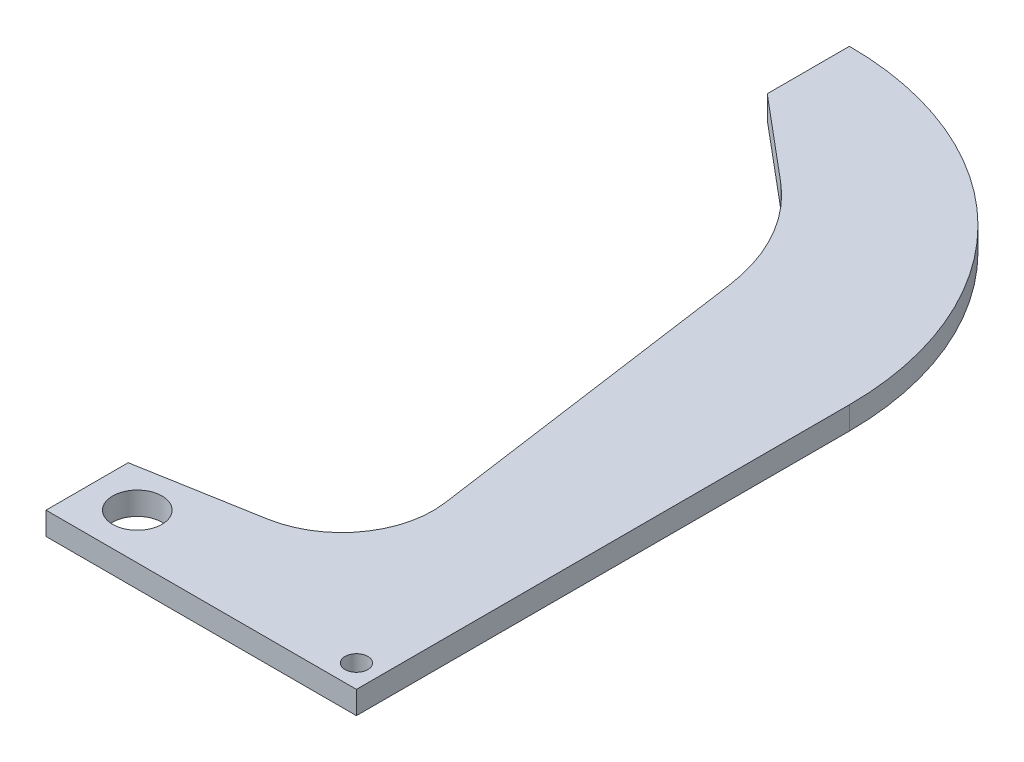
ISO-10303-21;
HEADER;
FILE_DESCRIPTION(('STEP AP214'),'2;1');
FILE_NAME('part.step','',(''),(''),'','','');
FILE_SCHEMA(('AUTOMOTIVE_DESIGN { 1 0 10303 214 1 1 1 1 }'));
ENDSEC;
DATA;
#1=APPLICATION_CONTEXT('core data for automotive mechanical design processes');
#2=APPLICATION_PROTOCOL_DEFINITION('international standard','automotive_design',2000,#1);
#3=PRODUCT_CONTEXT('',#1,'mechanical');
#4=PRODUCT('Part','Part','',(#3));
#5=PRODUCT_RELATED_PRODUCT_CATEGORY('part','',(#4));
#6=PRODUCT_DEFINITION_FORMATION('','',#4);
#7=PRODUCT_DEFINITION_CONTEXT('part definition',#1,'design');
#8=PRODUCT_DEFINITION('design','',#6,#7);
#9=PRODUCT_DEFINITION_SHAPE('','',#8);
#10=(LENGTH_UNIT() NAMED_UNIT(*) SI_UNIT(.MILLI.,.METRE.));
#11=(NAMED_UNIT(*) PLANE_ANGLE_UNIT() SI_UNIT($,.RADIAN.));
#12=(NAMED_UNIT(*) SI_UNIT($,.STERADIAN.) SOLID_ANGLE_UNIT());
#13=UNCERTAINTY_MEASURE_WITH_UNIT(LENGTH_MEASURE(1.E-05),#10,'distance_accuracy_value','');
#14=(GEOMETRIC_REPRESENTATION_CONTEXT(3) GLOBAL_UNCERTAINTY_ASSIGNED_CONTEXT((#13)) GLOBAL_UNIT_ASSIGNED_CONTEXT((#10,
#11,#12)) REPRESENTATION_CONTEXT('',''));
#15=CARTESIAN_POINT('',(0.,0.,0.));
#16=DIRECTION('',(0.,0.,1.));
#17=DIRECTION('',(1.,0.,0.));
#18=AXIS2_PLACEMENT_3D('',#15,#16,#17);
#19=CARTESIAN_POINT('',(0.,3.175,0.));
#20=DIRECTION('',(1.,0.,0.));
#21=DIRECTION('',(0.,0.,-1.));
#22=AXIS2_PLACEMENT_3D('',#19,#20,#21);
#23=PLANE('',#22);
#24=DIRECTION('',(0.,0.,1.));
#25=VECTOR('',#24,1.);
#26=CARTESIAN_POINT('',(0.,0.,0.));
#27=LINE('',#26,#25);
#28=CARTESIAN_POINT('',(0.,0.,-111.76));
#29=VERTEX_POINT('',#28);
#30=CARTESIAN_POINT('',(0.,0.,-100.33));
#31=VERTEX_POINT('',#30);
#32=EDGE_CURVE('E149',#29,#31,#27,.T.);
#33=ORIENTED_EDGE('',*,*,#32,.T.);
#34=DIRECTION('',(0.,1.,0.));
#35=VECTOR('',#34,1.);
#36=CARTESIAN_POINT('',(0.,0.,-100.33));
#37=LINE('',#36,#35);
#38=CARTESIAN_POINT('',(0.,3.175,-100.33));
#39=VERTEX_POINT('',#38);
#40=EDGE_CURVE('E131',#31,#39,#37,.T.);
#41=ORIENTED_EDGE('',*,*,#40,.T.);
#42=DIRECTION('',(0.,0.,1.));
#43=VECTOR('',#42,1.);
#44=CARTESIAN_POINT('',(0.,3.175,0.));
#45=LINE('',#44,#43);
#46=CARTESIAN_POINT('',(0.,3.175,-111.76));
#47=VERTEX_POINT('',#46);
#48=EDGE_CURVE('E217',#47,#39,#45,.T.);
#49=ORIENTED_EDGE('',*,*,#48,.F.);
#50=DIRECTION('',(0.,-1.,0.));
#51=VECTOR('',#50,1.);
#52=CARTESIAN_POINT('',(0.,3.175,-111.76));
#53=LINE('',#52,#51);
#54=EDGE_CURVE('E155',#47,#29,#53,.T.);
#55=ORIENTED_EDGE('',*,*,#54,.T.);
#56=EDGE_LOOP('',(#33,#41,#49,#55));
#57=FACE_BOUND('',#56,.T.);
#58=ADVANCED_FACE('F43',(#57),#23,.F.);
#59=CARTESIAN_POINT('',(0.,3.175,-68.58));
#60=DIRECTION('',(0.,1.,0.));
#61=DIRECTION('',(0.,0.,1.));
#62=AXIS2_PLACEMENT_3D('',#59,#60,#61);
#63=PLANE('',#62);
#64=DIRECTION('',(-0.76604444311898,0.,-0.642787609686536));
#65=VECTOR('',#64,1.);
#66=CARTESIAN_POINT('',(11.5786264068714,3.175,-90.6143788524547));
#67=LINE('',#66,#65);
#68=CARTESIAN_POINT('',(11.5786264068714,3.175,-90.6143788524547));
#69=VERTEX_POINT('',#68);
#70=EDGE_CURVE('E137',#69,#39,#67,.T.);
#71=ORIENTED_EDGE('',*,*,#70,.F.);
#72=CARTESIAN_POINT('',(-4.74817887916662,3.175,-71.1568499972326));
#73=DIRECTION('',(0.,1.,0.));
#74=DIRECTION('',(0.,0.,1.));
#75=AXIS2_PLACEMENT_3D('',#72,#73,#74);
#76=CIRCLE('',#75,25.4);
#77=CARTESIAN_POINT('',(20.4053667628325,3.175,-74.6866009283702));
#78=VERTEX_POINT('',#77);
#79=EDGE_CURVE('E153',#78,#69,#76,.T.);
#80=ORIENTED_EDGE('',*,*,#79,.F.);
#81=DIRECTION('',(-0.13896657209203,0.,-0.990297072519651));
#82=VECTOR('',#81,1.);
#83=CARTESIAN_POINT('',(26.8710352001998,3.175,-28.6112575632968));
#84=LINE('',#83,#82);
#85=CARTESIAN_POINT('',(26.8710352001998,3.175,-28.6112575632968));
#86=VERTEX_POINT('',#85);
#87=EDGE_CURVE('E241',#86,#78,#84,.T.);
#88=ORIENTED_EDGE('',*,*,#87,.F.);
#89=CARTESIAN_POINT('',(14.2942623792002,3.175,-26.846382097728));
#90=DIRECTION('',(0.,1.,0.));
#91=DIRECTION('',(0.,0.,-1.));
#92=AXIS2_PLACEMENT_3D('',#89,#90,#91);
#93=CIRCLE('',#92,12.7);
#94=CARTESIAN_POINT('',(16.4995942355703,3.175,-14.339323634473));
#95=VERTEX_POINT('',#94);
#96=EDGE_CURVE('E233',#95,#86,#93,.T.);
#97=ORIENTED_EDGE('',*,*,#96,.F.);
#98=DIRECTION('',(0.984807753012207,0.,-0.173648177666935));
#99=VECTOR('',#98,1.);
#100=CARTESIAN_POINT('',(16.4995942355703,3.175,-14.339323634473));
#101=LINE('',#100,#99);
#102=CARTESIAN_POINT('',(0.,3.175,-11.43));
#103=VERTEX_POINT('',#102);
#104=EDGE_CURVE('E230',#103,#95,#101,.T.);
#105=ORIENTED_EDGE('',*,*,#104,.F.);
#106=CARTESIAN_POINT('',(0.,3.175,0.));
#107=VERTEX_POINT('',#106);
#108=EDGE_CURVE('E96',#103,#107,#45,.T.);
#109=ORIENTED_EDGE('',*,*,#108,.T.);
#110=DIRECTION('',(1.,0.,0.));
#111=VECTOR('',#110,1.);
#112=CARTESIAN_POINT('',(0.,3.175,0.));
#113=LINE('',#112,#111);
#114=CARTESIAN_POINT('',(43.18,3.175,0.));
#115=VERTEX_POINT('',#114);
#116=EDGE_CURVE('E190',#107,#115,#113,.T.);
#117=ORIENTED_EDGE('',*,*,#116,.T.);
#118=DIRECTION('',(0.,0.,-1.));
#119=VECTOR('',#118,1.);
#120=CARTESIAN_POINT('',(43.18,3.175,0.));
#121=LINE('',#120,#119);
#122=CARTESIAN_POINT('',(43.18,3.175,-68.58));
#123=VERTEX_POINT('',#122);
#124=EDGE_CURVE('E184',#115,#123,#121,.T.);
#125=ORIENTED_EDGE('',*,*,#124,.T.);
#126=CARTESIAN_POINT('',(0.,3.175,-68.58));
#127=DIRECTION('',(0.,1.,0.));
#128=DIRECTION('',(0.,0.,1.));
#129=AXIS2_PLACEMENT_3D('',#126,#127,#128);
#130=CIRCLE('',#129,43.18);
#131=EDGE_CURVE('E68',#123,#47,#130,.T.);
#132=ORIENTED_EDGE('',*,*,#131,.T.);
#133=ORIENTED_EDGE('',*,*,#48,.T.);
#134=EDGE_LOOP('',(#71,#80,#88,#97,#105,#109,#117,#125,#132,#133));
#135=FACE_BOUND('',#134,.T.);
#136=CARTESIAN_POINT('',(6.35,3.175,-6.35));
#137=DIRECTION('',(0.,1.,0.));
#138=DIRECTION('',(0.,0.,1.));
#139=AXIS2_PLACEMENT_3D('',#136,#137,#138);
#140=CIRCLE('',#139,3.429);
#141=CARTESIAN_POINT('',(6.35,3.175,-2.921));
#142=VERTEX_POINT('',#141);
#143=EDGE_CURVE('E164',#142,#142,#140,.T.);
#144=ORIENTED_EDGE('',*,*,#143,.F.);
#145=EDGE_LOOP('',(#144));
#146=FACE_BOUND('',#145,.T.);
#147=CARTESIAN_POINT('',(40.005,3.175,-3.175));
#148=DIRECTION('',(0.,1.,0.));
#149=DIRECTION('',(0.,0.,1.));
#150=AXIS2_PLACEMENT_3D('',#147,#148,#149);
#151=CIRCLE('',#150,1.5875);
#152=CARTESIAN_POINT('',(40.005,3.175,-1.5875));
#153=VERTEX_POINT('',#152);
#154=EDGE_CURVE('E201',#153,#153,#151,.T.);
#155=ORIENTED_EDGE('',*,*,#154,.F.);
#156=EDGE_LOOP('',(#155));
#157=FACE_BOUND('',#156,.T.);
#158=ADVANCED_FACE('F223',(#135,#146,#157),#63,.T.);
#159=CARTESIAN_POINT('',(0.,0.,-68.58));
#160=DIRECTION('',(0.,1.,0.));
#161=DIRECTION('',(0.,0.,1.));
#162=AXIS2_PLACEMENT_3D('',#159,#160,#161);
#163=PLANE('',#162);
#164=CARTESIAN_POINT('',(-4.74817887916662,0.,-71.1568499972326));
#165=DIRECTION('',(0.,1.,0.));
#166=DIRECTION('',(0.,0.,1.));
#167=AXIS2_PLACEMENT_3D('',#164,#165,#166);
#168=CIRCLE('',#167,25.4);
#169=CARTESIAN_POINT('',(20.4053667628325,0.,-74.6866009283702));
#170=VERTEX_POINT('',#169);
#171=CARTESIAN_POINT('',(11.5786264068714,0.,-90.6143788524547));
#172=VERTEX_POINT('',#171);
#173=EDGE_CURVE('E143',#170,#172,#168,.T.);
#174=ORIENTED_EDGE('',*,*,#173,.T.);
#175=DIRECTION('',(-0.76604444311898,0.,-0.642787609686536));
#176=VECTOR('',#175,1.);
#177=CARTESIAN_POINT('',(11.5786264068714,0.,-90.6143788524547));
#178=LINE('',#177,#176);
#179=EDGE_CURVE('E134',#172,#31,#178,.T.);
#180=ORIENTED_EDGE('',*,*,#179,.T.);
#181=ORIENTED_EDGE('',*,*,#32,.F.);
#182=CARTESIAN_POINT('',(0.,0.,-68.58));
#183=DIRECTION('',(0.,1.,0.));
#184=DIRECTION('',(0.,0.,1.));
#185=AXIS2_PLACEMENT_3D('',#182,#183,#184);
#186=CIRCLE('',#185,43.18);
#187=CARTESIAN_POINT('',(43.18,0.,-68.58));
#188=VERTEX_POINT('',#187);
#189=EDGE_CURVE('E89',#188,#29,#186,.T.);
#190=ORIENTED_EDGE('',*,*,#189,.F.);
#191=DIRECTION('',(0.,0.,-1.));
#192=VECTOR('',#191,1.);
#193=CARTESIAN_POINT('',(43.18,0.,0.));
#194=LINE('',#193,#192);
#195=CARTESIAN_POINT('',(43.18,0.,0.));
#196=VERTEX_POINT('',#195);
#197=EDGE_CURVE('E162',#196,#188,#194,.T.);
#198=ORIENTED_EDGE('',*,*,#197,.F.);
#199=DIRECTION('',(1.,0.,0.));
#200=VECTOR('',#199,1.);
#201=CARTESIAN_POINT('',(0.,0.,0.));
#202=LINE('',#201,#200);
#203=CARTESIAN_POINT('',(0.,0.,0.));
#204=VERTEX_POINT('',#203);
#205=EDGE_CURVE('E157',#204,#196,#202,.T.);
#206=ORIENTED_EDGE('',*,*,#205,.F.);
#207=CARTESIAN_POINT('',(0.,0.,-11.43));
#208=VERTEX_POINT('',#207);
#209=EDGE_CURVE('E158',#208,#204,#27,.T.);
#210=ORIENTED_EDGE('',*,*,#209,.F.);
#211=DIRECTION('',(0.984807753012207,0.,-0.173648177666935));
#212=VECTOR('',#211,1.);
#213=CARTESIAN_POINT('',(16.4995942355703,0.,-14.339323634473));
#214=LINE('',#213,#212);
#215=CARTESIAN_POINT('',(16.4995942355703,0.,-14.339323634473));
#216=VERTEX_POINT('',#215);
#217=EDGE_CURVE('E59',#208,#216,#214,.T.);
#218=ORIENTED_EDGE('',*,*,#217,.T.);
#219=CARTESIAN_POINT('',(14.2942623792002,0.,-26.846382097728));
#220=DIRECTION('',(0.,1.,0.));
#221=DIRECTION('',(0.,0.,-1.));
#222=AXIS2_PLACEMENT_3D('',#219,#220,#221);
#223=CIRCLE('',#222,12.7);
#224=CARTESIAN_POINT('',(26.8710352001998,0.,-28.6112575632968));
#225=VERTEX_POINT('',#224);
#226=EDGE_CURVE('E262',#216,#225,#223,.T.);
#227=ORIENTED_EDGE('',*,*,#226,.T.);
#228=DIRECTION('',(-0.13896657209203,0.,-0.990297072519651));
#229=VECTOR('',#228,1.);
#230=CARTESIAN_POINT('',(26.8710352001998,0.,-28.6112575632968));
#231=LINE('',#230,#229);
#232=EDGE_CURVE('E255',#225,#170,#231,.T.);
#233=ORIENTED_EDGE('',*,*,#232,.T.);
#234=EDGE_LOOP('',(#174,#180,#181,#190,#198,#206,#210,#218,#227,#233));
#235=FACE_BOUND('',#234,.T.);
#236=CARTESIAN_POINT('',(6.35,0.,-6.35));
#237=DIRECTION('',(0.,1.,0.));
#238=DIRECTION('',(0.,0.,1.));
#239=AXIS2_PLACEMENT_3D('',#236,#237,#238);
#240=CIRCLE('',#239,3.429);
#241=CARTESIAN_POINT('',(6.35,0.,-2.921));
#242=VERTEX_POINT('',#241);
#243=EDGE_CURVE('E205',#242,#242,#240,.T.);
#244=ORIENTED_EDGE('',*,*,#243,.T.);
#245=EDGE_LOOP('',(#244));
#246=FACE_BOUND('',#245,.T.);
#247=CARTESIAN_POINT('',(40.005,0.,-3.175));
#248=DIRECTION('',(0.,1.,0.));
#249=DIRECTION('',(0.,0.,1.));
#250=AXIS2_PLACEMENT_3D('',#247,#248,#249);
#251=CIRCLE('',#250,1.5875);
#252=CARTESIAN_POINT('',(40.005,0.,-1.5875));
#253=VERTEX_POINT('',#252);
#254=EDGE_CURVE('E206',#253,#253,#251,.T.);
#255=ORIENTED_EDGE('',*,*,#254,.T.);
#256=EDGE_LOOP('',(#255));
#257=FACE_BOUND('',#256,.T.);
#258=ADVANCED_FACE('F147',(#235,#246,#257),#163,.F.);
#259=ORIENTED_EDGE('',*,*,#108,.F.);
#260=DIRECTION('',(0.,1.,0.));
#261=VECTOR('',#260,1.);
#262=CARTESIAN_POINT('',(0.,0.,-11.43));
#263=LINE('',#262,#261);
#264=EDGE_CURVE('E142',#208,#103,#263,.T.);
#265=ORIENTED_EDGE('',*,*,#264,.F.);
#266=ORIENTED_EDGE('',*,*,#209,.T.);
#267=DIRECTION('',(0.,-1.,0.));
#268=VECTOR('',#267,1.);
#269=CARTESIAN_POINT('',(0.,3.175,0.));
#270=LINE('',#269,#268);
#271=EDGE_CURVE('E11',#107,#204,#270,.T.);
#272=ORIENTED_EDGE('',*,*,#271,.F.);
#273=EDGE_LOOP('',(#259,#265,#266,#272));
#274=FACE_BOUND('',#273,.T.);
#275=ADVANCED_FACE('F45',(#274),#23,.F.);
#276=CARTESIAN_POINT('',(0.,3.175,0.));
#277=DIRECTION('',(0.,0.,-1.));
#278=DIRECTION('',(-1.,0.,0.));
#279=AXIS2_PLACEMENT_3D('',#276,#277,#278);
#280=PLANE('',#279);
#281=ORIENTED_EDGE('',*,*,#205,.T.);
#282=DIRECTION('',(0.,-1.,0.));
#283=VECTOR('',#282,1.);
#284=CARTESIAN_POINT('',(43.18,3.175,0.));
#285=LINE('',#284,#283);
#286=EDGE_CURVE('E52',#115,#196,#285,.T.);
#287=ORIENTED_EDGE('',*,*,#286,.F.);
#288=ORIENTED_EDGE('',*,*,#116,.F.);
#289=ORIENTED_EDGE('',*,*,#271,.T.);
#290=EDGE_LOOP('',(#281,#287,#288,#289));
#291=FACE_BOUND('',#290,.T.);
#292=ADVANCED_FACE('F189',(#291),#280,.F.);
#293=CARTESIAN_POINT('',(43.18,3.175,0.));
#294=DIRECTION('',(-1.,0.,0.));
#295=DIRECTION('',(0.,0.,1.));
#296=AXIS2_PLACEMENT_3D('',#293,#294,#295);
#297=PLANE('',#296);
#298=ORIENTED_EDGE('',*,*,#197,.T.);
#299=DIRECTION('',(0.,-1.,0.));
#300=VECTOR('',#299,1.);
#301=CARTESIAN_POINT('',(43.18,3.175,-68.58));
#302=LINE('',#301,#300);
#303=EDGE_CURVE('E174',#123,#188,#302,.T.);
#304=ORIENTED_EDGE('',*,*,#303,.F.);
#305=ORIENTED_EDGE('',*,*,#124,.F.);
#306=ORIENTED_EDGE('',*,*,#286,.T.);
#307=EDGE_LOOP('',(#298,#304,#305,#306));
#308=FACE_BOUND('',#307,.T.);
#309=ADVANCED_FACE('F182',(#308),#297,.F.);
#310=CARTESIAN_POINT('',(0.,3.175,-68.58));
#311=DIRECTION('',(0.,-1.,0.));
#312=DIRECTION('',(0.,0.,-1.));
#313=AXIS2_PLACEMENT_3D('',#310,#311,#312);
#314=CYLINDRICAL_SURFACE('',#313,43.18);
#315=ORIENTED_EDGE('',*,*,#189,.T.);
#316=ORIENTED_EDGE('',*,*,#54,.F.);
#317=ORIENTED_EDGE('',*,*,#131,.F.);
#318=ORIENTED_EDGE('',*,*,#303,.T.);
#319=EDGE_LOOP('',(#315,#316,#317,#318));
#320=FACE_BOUND('',#319,.T.);
#321=ADVANCED_FACE('F225',(#320),#314,.T.);
#322=CARTESIAN_POINT('',(6.35,3.175,-6.35));
#323=DIRECTION('',(0.,-1.,0.));
#324=DIRECTION('',(0.,0.,-1.));
#325=AXIS2_PLACEMENT_3D('',#322,#323,#324);
#326=CYLINDRICAL_SURFACE('',#325,3.429);
#327=ORIENTED_EDGE('',*,*,#143,.T.);
#328=EDGE_LOOP('',(#327));
#329=FACE_BOUND('',#328,.T.);
#330=ORIENTED_EDGE('',*,*,#243,.F.);
#331=EDGE_LOOP('',(#330));
#332=FACE_BOUND('',#331,.T.);
#333=ADVANCED_FACE('F293',(#329,#332),#326,.F.);
#334=CARTESIAN_POINT('',(40.005,3.175,-3.175));
#335=DIRECTION('',(0.,-1.,0.));
#336=DIRECTION('',(0.,0.,-1.));
#337=AXIS2_PLACEMENT_3D('',#334,#335,#336);
#338=CYLINDRICAL_SURFACE('',#337,1.5875);
#339=ORIENTED_EDGE('',*,*,#154,.T.);
#340=EDGE_LOOP('',(#339));
#341=FACE_BOUND('',#340,.T.);
#342=ORIENTED_EDGE('',*,*,#254,.F.);
#343=EDGE_LOOP('',(#342));
#344=FACE_BOUND('',#343,.T.);
#345=ADVANCED_FACE('F309',(#341,#344),#338,.F.);
#346=CARTESIAN_POINT('',(11.5786264068714,0.,-90.6143788524547));
#347=DIRECTION('',(0.642787609686536,0.,-0.76604444311898));
#348=DIRECTION('',(-0.766044443118981,0.,-0.642787609686537));
#349=AXIS2_PLACEMENT_3D('',#346,#347,#348);
#350=PLANE('',#349);
#351=ORIENTED_EDGE('',*,*,#70,.T.);
#352=ORIENTED_EDGE('',*,*,#40,.F.);
#353=ORIENTED_EDGE('',*,*,#179,.F.);
#354=DIRECTION('',(0.,1.,0.));
#355=VECTOR('',#354,1.);
#356=CARTESIAN_POINT('',(11.5786264068714,0.,-90.6143788524547));
#357=LINE('',#356,#355);
#358=EDGE_CURVE('E210',#172,#69,#357,.T.);
#359=ORIENTED_EDGE('',*,*,#358,.T.);
#360=EDGE_LOOP('',(#351,#352,#353,#359));
#361=FACE_BOUND('',#360,.T.);
#362=ADVANCED_FACE('F133',(#361),#350,.F.);
#363=CARTESIAN_POINT('',(-4.74817887916662,0.,-71.1568499972326));
#364=DIRECTION('',(0.,1.,0.));
#365=DIRECTION('',(0.,0.,1.));
#366=AXIS2_PLACEMENT_3D('',#363,#364,#365);
#367=CYLINDRICAL_SURFACE('',#366,25.4);
#368=ORIENTED_EDGE('',*,*,#79,.T.);
#369=ORIENTED_EDGE('',*,*,#358,.F.);
#370=ORIENTED_EDGE('',*,*,#173,.F.);
#371=DIRECTION('',(0.,1.,0.));
#372=VECTOR('',#371,1.);
#373=CARTESIAN_POINT('',(20.4053667628325,0.,-74.6866009283702));
#374=LINE('',#373,#372);
#375=EDGE_CURVE('E249',#170,#78,#374,.T.);
#376=ORIENTED_EDGE('',*,*,#375,.T.);
#377=EDGE_LOOP('',(#368,#369,#370,#376));
#378=FACE_BOUND('',#377,.T.);
#379=ADVANCED_FACE('F323',(#378),#367,.F.);
#380=CARTESIAN_POINT('',(26.8710352001998,0.,-28.6112575632968));
#381=DIRECTION('',(0.990297072519651,0.,-0.13896657209203));
#382=DIRECTION('',(-0.13896657209203,0.,-0.990297072519651));
#383=AXIS2_PLACEMENT_3D('',#380,#381,#382);
#384=PLANE('',#383);
#385=ORIENTED_EDGE('',*,*,#87,.T.);
#386=ORIENTED_EDGE('',*,*,#375,.F.);
#387=ORIENTED_EDGE('',*,*,#232,.F.);
#388=DIRECTION('',(0.,1.,0.));
#389=VECTOR('',#388,1.);
#390=CARTESIAN_POINT('',(26.8710352001998,0.,-28.6112575632968));
#391=LINE('',#390,#389);
#392=EDGE_CURVE('E197',#225,#86,#391,.T.);
#393=ORIENTED_EDGE('',*,*,#392,.T.);
#394=EDGE_LOOP('',(#385,#386,#387,#393));
#395=FACE_BOUND('',#394,.T.);
#396=ADVANCED_FACE('F254',(#395),#384,.F.);
#397=CARTESIAN_POINT('',(14.2942623792002,0.,-26.846382097728));
#398=DIRECTION('',(0.,1.,0.));
#399=DIRECTION('',(0.,0.,1.));
#400=AXIS2_PLACEMENT_3D('',#397,#398,#399);
#401=CYLINDRICAL_SURFACE('',#400,12.7);
#402=ORIENTED_EDGE('',*,*,#96,.T.);
#403=ORIENTED_EDGE('',*,*,#392,.F.);
#404=ORIENTED_EDGE('',*,*,#226,.F.);
#405=DIRECTION('',(0.,1.,0.));
#406=VECTOR('',#405,1.);
#407=CARTESIAN_POINT('',(16.4995942355703,0.,-14.339323634473));
#408=LINE('',#407,#406);
#409=EDGE_CURVE('E194',#216,#95,#408,.T.);
#410=ORIENTED_EDGE('',*,*,#409,.T.);
#411=EDGE_LOOP('',(#402,#403,#404,#410));
#412=FACE_BOUND('',#411,.T.);
#413=ADVANCED_FACE('F260',(#412),#401,.F.);
#414=CARTESIAN_POINT('',(16.4995942355703,0.,-14.339323634473));
#415=DIRECTION('',(0.173648177666935,0.,0.984807753012207));
#416=DIRECTION('',(0.984807753012207,0.,-0.173648177666935));
#417=AXIS2_PLACEMENT_3D('',#414,#415,#416);
#418=PLANE('',#417);
#419=ORIENTED_EDGE('',*,*,#104,.T.);
#420=ORIENTED_EDGE('',*,*,#409,.F.);
#421=ORIENTED_EDGE('',*,*,#217,.F.);
#422=ORIENTED_EDGE('',*,*,#264,.T.);
#423=EDGE_LOOP('',(#419,#420,#421,#422));
#424=FACE_BOUND('',#423,.T.);
#425=ADVANCED_FACE('F261',(#424),#418,.F.);
#426=CLOSED_SHELL('',(#58,#158,#258,#275,#292,#309,#321,#333,#345,#362,#379,#396,#413,#425));
#427=MANIFOLD_SOLID_BREP('B2',#426);
#428=ADVANCED_BREP_SHAPE_REPRESENTATION('',(#18,#427),#14);
#429=SHAPE_DEFINITION_REPRESENTATION(#9,#428);
ENDSEC;
END-ISO-10303-21;
